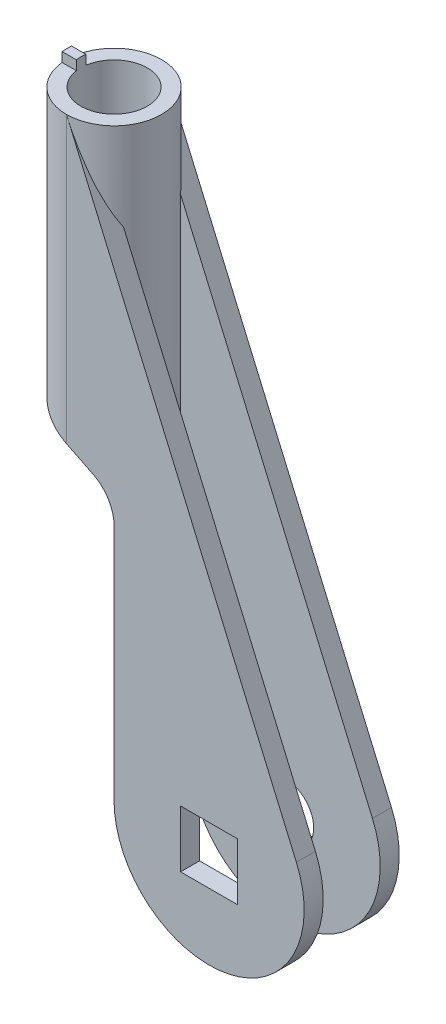
ISO-10303-21;
HEADER;
FILE_DESCRIPTION(('STEP AP214'),'2;1');
FILE_NAME('part.step','',(''),(''),'','','');
FILE_SCHEMA(('AUTOMOTIVE_DESIGN { 1 0 10303 214 1 1 1 1 }'));
ENDSEC;
DATA;
#1=APPLICATION_CONTEXT('core data for automotive mechanical design processes');
#2=APPLICATION_PROTOCOL_DEFINITION('international standard','automotive_design',2000,#1);
#3=PRODUCT_CONTEXT('',#1,'mechanical');
#4=PRODUCT('Part','Part','',(#3));
#5=PRODUCT_RELATED_PRODUCT_CATEGORY('part','',(#4));
#6=PRODUCT_DEFINITION_FORMATION('','',#4);
#7=PRODUCT_DEFINITION_CONTEXT('part definition',#1,'design');
#8=PRODUCT_DEFINITION('design','',#6,#7);
#9=PRODUCT_DEFINITION_SHAPE('','',#8);
#10=(LENGTH_UNIT() NAMED_UNIT(*) SI_UNIT(.MILLI.,.METRE.));
#11=(NAMED_UNIT(*) PLANE_ANGLE_UNIT() SI_UNIT($,.RADIAN.));
#12=(NAMED_UNIT(*) SI_UNIT($,.STERADIAN.) SOLID_ANGLE_UNIT());
#13=UNCERTAINTY_MEASURE_WITH_UNIT(LENGTH_MEASURE(1.E-05),#10,'distance_accuracy_value','');
#14=(GEOMETRIC_REPRESENTATION_CONTEXT(3) GLOBAL_UNCERTAINTY_ASSIGNED_CONTEXT((#13)) GLOBAL_UNIT_ASSIGNED_CONTEXT((#10,
#11,#12)) REPRESENTATION_CONTEXT('',''));
#15=CARTESIAN_POINT('',(0.,0.,0.));
#16=DIRECTION('',(0.,0.,1.));
#17=DIRECTION('',(1.,0.,0.));
#18=AXIS2_PLACEMENT_3D('',#15,#16,#17);
#19=CARTESIAN_POINT('',(9.57106781187315,60.,11.0355339059263));
#20=DIRECTION('',(0.,1.,0.));
#21=DIRECTION('',(-1.6688267556369E-12,0.,-1.));
#22=AXIS2_PLACEMENT_3D('',#19,#20,#21);
#23=PLANE('',#22);
#24=CARTESIAN_POINT('',(-5.42893218813521,60.,6.0355339059513));
#25=DIRECTION('',(0.,1.,0.));
#26=DIRECTION('',(-1.6688267556369E-12,0.,-1.));
#27=AXIS2_PLACEMENT_3D('',#24,#25,#26);
#28=CIRCLE('',#27,5.);
#29=CARTESIAN_POINT('',(-5.42893218814353,60.0000000000001,1.03553390595129));
#30=VERTEX_POINT('',#29);
#31=CARTESIAN_POINT('',(-10.4038693736683,60.0000000000001,5.53553390595127));
#32=VERTEX_POINT('',#31);
#33=EDGE_CURVE('E365',#30,#32,#28,.T.);
#34=ORIENTED_EDGE('',*,*,#33,.T.);
#35=DIRECTION('',(1.,0.,0.));
#36=VECTOR('',#35,1.);
#37=CARTESIAN_POINT('',(0.,60.,5.5355339059513));
#38=LINE('',#37,#36);
#39=CARTESIAN_POINT('',(-8.89303380327294,60.0000000000001,5.53553390595129));
#40=VERTEX_POINT('',#39);
#41=EDGE_CURVE('E59',#32,#40,#38,.T.);
#42=ORIENTED_EDGE('',*,*,#41,.T.);
#43=CARTESIAN_POINT('',(-5.42893218813521,60.,6.0355339059513));
#44=DIRECTION('',(0.,1.,0.));
#45=DIRECTION('',(-1.6688267556369E-12,0.,-1.));
#46=AXIS2_PLACEMENT_3D('',#43,#44,#45);
#47=CIRCLE('',#46,3.5);
#48=CARTESIAN_POINT('',(-8.89303380327297,60.,6.5355339059513));
#49=VERTEX_POINT('',#48);
#50=EDGE_CURVE('E273',#49,#40,#47,.T.);
#51=ORIENTED_EDGE('',*,*,#50,.F.);
#52=DIRECTION('',(1.,0.,0.));
#53=VECTOR('',#52,1.);
#54=CARTESIAN_POINT('',(0.,60.,6.5355339059513));
#55=LINE('',#54,#53);
#56=CARTESIAN_POINT('',(-10.4038693736683,59.9999999999999,6.53553390595124));
#57=VERTEX_POINT('',#56);
#58=EDGE_CURVE('E214',#57,#49,#55,.T.);
#59=ORIENTED_EDGE('',*,*,#58,.F.);
#60=CARTESIAN_POINT('',(-5.42893218812687,60.,11.0355339059513));
#61=VERTEX_POINT('',#60);
#62=EDGE_CURVE('E374',#57,#61,#28,.T.);
#63=ORIENTED_EDGE('',*,*,#62,.T.);
#64=EDGE_CURVE('E368',#61,#30,#28,.T.);
#65=ORIENTED_EDGE('',*,*,#64,.T.);
#66=EDGE_LOOP('',(#34,#42,#51,#59,#63,#65));
#67=FACE_BOUND('',#66,.T.);
#68=ADVANCED_FACE('F44',(#67),#23,.T.);
#69=EDGE_CURVE('E371',#32,#57,#28,.T.);
#70=ORIENTED_EDGE('',*,*,#69,.T.);
#71=DIRECTION('',(0.,0.,-0.999999999999999));
#72=VECTOR('',#71,1.);
#73=CARTESIAN_POINT('',(-10.4038693736684,60.,0.));
#74=LINE('',#73,#72);
#75=EDGE_CURVE('E225',#57,#32,#74,.T.);
#76=ORIENTED_EDGE('',*,*,#75,.T.);
#77=EDGE_LOOP('',(#70,#76));
#78=FACE_BOUND('',#77,.T.);
#79=ADVANCED_FACE('F356',(#78),#23,.T.);
#80=CARTESIAN_POINT('',(-4.42893218814358,25.0433612547143,1.03553390594963));
#81=DIRECTION('',(1.6688267556369E-12,0.,1.));
#82=DIRECTION('',(1.,0.,-1.66950285710849E-12));
#83=AXIS2_PLACEMENT_3D('',#80,#81,#82);
#84=CYLINDRICAL_SURFACE('',#83,4.);
#85=CARTESIAN_POINT('',(-2.65608144814369,28.6290271975656,8.17125363796861));
#86=CARTESIAN_POINT('',(-2.59947304160336,28.6010404334438,8.09773247455495));
#87=CARTESIAN_POINT('',(-2.5458343863294,28.5728488683427,8.02206802871244));
#88=CARTESIAN_POINT('',(-2.44461643168852,28.516952419425,7.86651968466592));
#89=CARTESIAN_POINT('',(-2.39704237177961,28.4892479740253,7.78663222117927));
#90=CARTESIAN_POINT('',(-2.26310803119054,28.4079047376702,7.53977461289583));
#91=CARTESIAN_POINT('',(-2.18634107484344,28.3564578399003,7.36665181326748));
#92=CARTESIAN_POINT('',(-2.07061440016777,28.274862328395,7.03440468530713));
#93=CARTESIAN_POINT('',(-2.02767391852254,28.2426620047851,6.87717304754921));
#94=CARTESIAN_POINT('',(-1.96407165187108,28.1939335290622,6.55639744599862));
#95=CARTESIAN_POINT('',(-1.9433194223138,28.1773417862052,6.39288194470546));
#96=CARTESIAN_POINT('',(-1.92512236978287,28.1628327762202,6.06285772337778));
#97=CARTESIAN_POINT('',(-1.92779451929789,28.1650092294836,5.89633812995289));
#98=CARTESIAN_POINT('',(-1.95654968119447,28.1878202798559,5.56643984367559));
#99=CARTESIAN_POINT('',(-1.98267055756278,28.2084847303987,5.40306666751046));
#100=CARTESIAN_POINT('',(-2.05480709207526,28.2628977486258,5.09244071423059));
#101=CARTESIAN_POINT('',(-2.09971857398665,28.295910727965,4.94479139989025));
#102=CARTESIAN_POINT('',(-2.20754311348656,28.3704785789696,4.65856402719408));
#103=CARTESIAN_POINT('',(-2.27045743018141,28.4120340480338,4.51998660415358));
#104=CARTESIAN_POINT('',(-2.38745099135087,28.4835987559347,4.30093380372427));
#105=CARTESIAN_POINT('',(-2.43664463654024,28.5124230676206,4.2174017414817));
#106=CARTESIAN_POINT('',(-2.54153232794323,28.5705859980704,4.05507736432179));
#107=CARTESIAN_POINT('',(-2.59720749077307,28.5999229211695,3.97627224623719));
#108=CARTESIAN_POINT('',(-2.6560814481508,28.6290271975657,3.89981417392474));
#109=B_SPLINE_CURVE_WITH_KNOTS('',3,(#85,#86,#87,#88,#89,#90,#91,#92,#93,#94,#95,#96,#97,#98,
#99,#100,#101,#102,#103,#104,#105,#106,#107,#108),.UNSPECIFIED.,.F.,.F.,(4,2,2,2,2,2,2,2,2,2,2,
4),(0.,0.290583111722299,0.581415593062103,1.1671879678296,1.66361088163463,2.15800245235231,
2.65486422851952,3.15252976156556,3.62433832928742,4.09617990305655,4.39929511572905,
4.70154834256747),.UNSPECIFIED.);
#110=CARTESIAN_POINT('',(-2.65608144814369,28.6290271975656,8.17125363796856));
#111=VERTEX_POINT('',#110);
#112=CARTESIAN_POINT('',(-2.38468650150214,28.4815380350289,7.76254525490521));
#113=VERTEX_POINT('',#112);
#114=EDGE_CURVE('E277',#111,#113,#109,.T.);
#115=ORIENTED_EDGE('',*,*,#114,.T.);
#116=CARTESIAN_POINT('',(-4.42893218812589,25.0433612547143,11.617842823443));
#117=DIRECTION('',(0.,0.746327346242791,0.665579065363533));
#118=DIRECTION('',(2.23603464499337E-12,-0.665579065363533,0.74632734624279));
#119=AXIS2_PLACEMENT_3D('',#116,#117,#118);
#120=ELLIPSE('',#119,6.00980440665639,4.);
#121=CARTESIAN_POINT('',(-1.2889513842407,27.5213686298453,8.83920274220593));
#122=VERTEX_POINT('',#121);
#123=EDGE_CURVE('E239',#113,#122,#120,.F.);
#124=ORIENTED_EDGE('',*,*,#123,.T.);
#125=CARTESIAN_POINT('',(-2.65608144814025,28.6290271975657,10.1962187983349));
#126=CARTESIAN_POINT('',(-2.52347440856721,28.5634294587663,10.1078325729526));
#127=CARTESIAN_POINT('',(-2.3973034191134,28.4919296294869,10.0146065776875));
#128=CARTESIAN_POINT('',(-2.15801586280122,28.3392799317188,9.82034720945337));
#129=CARTESIAN_POINT('',(-2.04486804553051,28.2581541546402,9.71933354037612));
#130=CARTESIAN_POINT('',(-1.83210623381481,28.0888187804616,9.51184426236549));
#131=CARTESIAN_POINT('',(-1.73238126794075,28.0006782728253,9.40542494041571));
#132=CARTESIAN_POINT('',(-1.54485161806082,27.8181077552125,9.1874544467729));
#133=CARTESIAN_POINT('',(-1.45705597895274,27.7236730529025,9.07589946603857));
#134=CARTESIAN_POINT('',(-1.27524266237927,27.5087472187694,8.82407114017819));
#135=CARTESIAN_POINT('',(-1.18400939729774,27.3870488581225,8.68281916086108));
#136=CARTESIAN_POINT('',(-1.01794862274968,27.1380191288297,8.39577150701604));
#137=CARTESIAN_POINT('',(-0.943122404127505,27.0106873179117,8.24997547600923));
#138=CARTESIAN_POINT('',(-0.808986851321167,26.7513915499206,7.95451996042364));
#139=CARTESIAN_POINT('',(-0.749727097751368,26.6194142746281,7.80484976000237));
#140=CARTESIAN_POINT('',(-0.646491829974307,26.3524160668158,7.50307847653511));
#141=CARTESIAN_POINT('',(-0.602512779257779,26.2173958462573,7.35097796448637));
#142=CARTESIAN_POINT('',(-0.520414618088164,25.9118618761323,7.00755502803962));
#143=CARTESIAN_POINT('',(-0.486382116618399,25.7407692124152,6.81576735787453));
#144=CARTESIAN_POINT('',(-0.440873409439674,25.397354012368,6.43131410625835));
#145=CARTESIAN_POINT('',(-0.429349143698314,25.225034886723,6.23865127771172));
#146=CARTESIAN_POINT('',(-0.428935894385796,25.0496466215844,6.0425611598349));
#147=CARTESIAN_POINT('',(-0.428932190854305,25.0465039232627,6.03904751629875));
#148=CARTESIAN_POINT('',(-0.42893218813516,25.0433612547143,6.03553390594305));
#149=B_SPLINE_CURVE_WITH_KNOTS('',3,(#125,#126,#127,#128,#129,#130,#131,#132,#133,#134,#135,
#136,#137,#138,#139,#140,#141,#142,#143,#144,#145,#146,#147,#148),.UNSPECIFIED.,.F.,.F.,(4,2,2,
2,2,2,2,2,2,2,2,4),(0.,0.516397999134937,1.03152980920846,1.54210006168354,2.05305529724287,
2.67489400277838,3.29678161469038,3.9206266153515,4.54432713931521,5.3210862760402,
6.09618504014729,6.11032718013581),.UNSPECIFIED.);
#150=CARTESIAN_POINT('',(-1.42893218813019,27.6891125657789,9.03553390594464));
#151=VERTEX_POINT('',#150);
#152=EDGE_CURVE('E315',#151,#122,#149,.T.);
#153=ORIENTED_EDGE('',*,*,#152,.F.);
#154=CARTESIAN_POINT('',(-4.4289321881302,25.0433612547143,9.03553390594961));
#155=DIRECTION('',(-1.6688267556369E-12,0.,-1.));
#156=DIRECTION('',(-1.,0.,1.66950285710849E-12));
#157=AXIS2_PLACEMENT_3D('',#154,#155,#156);
#158=CIRCLE('',#157,4.);
#159=CARTESIAN_POINT('',(-0.428932188130227,25.0433612547143,9.03553390594305));
#160=VERTEX_POINT('',#159);
#161=EDGE_CURVE('E322',#160,#151,#158,.F.);
#162=ORIENTED_EDGE('',*,*,#161,.F.);
#163=DIRECTION('',(1.6688267556369E-12,0.,1.));
#164=VECTOR('',#163,1.);
#165=CARTESIAN_POINT('',(-0.428932188148573,25.0433612547142,-1.96446609405706));
#166=LINE('',#165,#164);
#167=CARTESIAN_POINT('',(-0.428932188126889,25.0433612547142,11.0355339059429));
#168=VERTEX_POINT('',#167);
#169=EDGE_CURVE('E715',#160,#168,#166,.T.);
#170=ORIENTED_EDGE('',*,*,#169,.T.);
#171=CARTESIAN_POINT('',(-4.42893218812692,25.0433612547143,11.0355339059497));
#172=DIRECTION('',(-1.6688267556369E-12,0.,-1.));
#173=DIRECTION('',(1.,0.,-1.66950285710849E-12));
#174=AXIS2_PLACEMENT_3D('',#171,#172,#173);
#175=CIRCLE('',#174,4.);
#176=CARTESIAN_POINT('',(-2.65608144813889,28.6290271975656,11.0355339059467));
#177=VERTEX_POINT('',#176);
#178=EDGE_CURVE('E714',#177,#168,#175,.T.);
#179=ORIENTED_EDGE('',*,*,#178,.F.);
#180=DIRECTION('',(1.6688267556369E-12,0.,1.));
#181=VECTOR('',#180,1.);
#182=CARTESIAN_POINT('',(-2.65608144815555,28.6290271975656,1.03553390594666));
#183=LINE('',#182,#181);
#184=EDGE_CURVE('E463',#111,#177,#183,.T.);
#185=ORIENTED_EDGE('',*,*,#184,.F.);
#186=EDGE_LOOP('',(#115,#124,#153,#162,#170,#179,#185));
#187=FACE_BOUND('',#186,.T.);
#188=ADVANCED_FACE('F331',(#187),#84,.F.);
#189=CARTESIAN_POINT('',(-5.4289321881352,25.,6.03553390595127));
#190=DIRECTION('',(0.,1.,0.));
#191=DIRECTION('',(-1.6688267556369E-12,0.,-1.));
#192=AXIS2_PLACEMENT_3D('',#189,#190,#191);
#193=CYLINDRICAL_SURFACE('',#192,5.);
#194=DIRECTION('',(0.,1.,0.));
#195=VECTOR('',#194,1.);
#196=CARTESIAN_POINT('',(-5.42893218814358,29.9999999999999,1.03553390595129));
#197=LINE('',#196,#195);
#198=CARTESIAN_POINT('',(-5.42893218814358,29.9999999999999,1.03553390595129));
#199=VERTEX_POINT('',#198);
#200=EDGE_CURVE('E449',#199,#30,#197,.T.);
#201=ORIENTED_EDGE('',*,*,#200,.F.);
#202=CARTESIAN_POINT('',(-5.42893218813523,30.,6.03553390595132));
#203=DIRECTION('',(-0.44321268499701,-0.896416485712832,7.39988962111319E-13));
#204=DIRECTION('',(-0.896416485712833,0.44321268499701,1.49657500419942E-12));
#205=AXIS2_PLACEMENT_3D('',#202,#203,#204);
#206=ELLIPSE('',#205,5.57776444285716,5.);
#207=CARTESIAN_POINT('',(-5.42893218812184,29.9999999999975,11.0355339059514));
#208=VERTEX_POINT('',#207);
#209=EDGE_CURVE('E323',#199,#208,#206,.F.);
#210=ORIENTED_EDGE('',*,*,#209,.T.);
#211=DIRECTION('',(0.,1.,0.));
#212=VECTOR('',#211,1.);
#213=CARTESIAN_POINT('',(-5.42893218812689,30.,11.0355339059513));
#214=LINE('',#213,#212);
#215=EDGE_CURVE('E396',#208,#61,#214,.T.);
#216=ORIENTED_EDGE('',*,*,#215,.T.);
#217=ORIENTED_EDGE('',*,*,#62,.F.);
#218=ORIENTED_EDGE('',*,*,#69,.F.);
#219=ORIENTED_EDGE('',*,*,#33,.F.);
#220=EDGE_LOOP('',(#201,#210,#216,#217,#218,#219));
#221=FACE_BOUND('',#220,.T.);
#222=ADVANCED_FACE('F325',(#221),#193,.T.);
#223=CARTESIAN_POINT('',(-5.42893218813523,30.0216967941788,6.0355339059513));
#224=DIRECTION('',(0.,0.746327346242791,0.665579065363533));
#225=DIRECTION('',(0.,0.665579065363534,-0.74632734624279));
#226=AXIS2_PLACEMENT_3D('',#223,#224,#225);
#227=ELLIPSE('',#226,6.69947312686762,5.);
#228=CARTESIAN_POINT('',(-0.431876780350865,30.1747064816139,5.86396103066786));
#229=VERTEX_POINT('',#228);
#230=EDGE_CURVE('E242',#229,#122,#227,.F.);
#231=ORIENTED_EDGE('',*,*,#230,.F.);
#232=CARTESIAN_POINT('',(-5.42893218813517,30.3462793568973,6.03553390595129));
#233=DIRECTION('',(0.,0.707106781186639,-0.707106781186456));
#234=DIRECTION('',(0.,0.707106781186457,0.707106781186638));
#235=AXIS2_PLACEMENT_3D('',#232,#233,#234);
#236=ELLIPSE('',#235,7.07106781186456,5.);
#237=CARTESIAN_POINT('',(-1.29671717577226,27.5311773886557,3.22043193770891));
#238=VERTEX_POINT('',#237);
#239=EDGE_CURVE('E237',#238,#229,#236,.F.);
#240=ORIENTED_EDGE('',*,*,#239,.F.);
#241=CARTESIAN_POINT('',(-2.65608144815412,28.6290271975656,1.87484901355839));
#242=CARTESIAN_POINT('',(-2.52347440858075,28.5634294587662,1.96323523894033));
#243=CARTESIAN_POINT('',(-2.39730341912661,28.4919296294868,2.056461234205));
#244=CARTESIAN_POINT('',(-2.15801586281377,28.3392799317187,2.25072060243831));
#245=CARTESIAN_POINT('',(-2.04486804554273,28.2581541546402,2.35173427151519));
#246=CARTESIAN_POINT('',(-1.83210623382633,28.0888187804616,2.55922354952512));
#247=CARTESIAN_POINT('',(-1.73238126795192,28.0006782728252,2.66564287147457));
#248=CARTESIAN_POINT('',(-1.54485161807129,27.8181077552124,2.88361336511674));
#249=CARTESIAN_POINT('',(-1.45705597896287,27.7236730529024,2.99516834585076));
#250=CARTESIAN_POINT('',(-1.27524266238858,27.5087472187692,3.24699667171052));
#251=CARTESIAN_POINT('',(-1.18400939730654,27.3870488581224,3.38824865102736));
#252=CARTESIAN_POINT('',(-1.0179486227575,27.1380191288297,3.67529630487187));
#253=CARTESIAN_POINT('',(-0.943122404134855,27.0106873179117,3.82109233587841));
#254=CARTESIAN_POINT('',(-0.808986851327538,26.7513915499205,4.11654785146355));
#255=CARTESIAN_POINT('',(-0.749727097757227,26.619414274628,4.26621805188464));
#256=CARTESIAN_POINT('',(-0.646491829979183,26.3524160668157,4.56798933535157));
#257=CARTESIAN_POINT('',(-0.602512779262182,26.2173958462572,4.72008984740017));
#258=CARTESIAN_POINT('',(-0.520414618091473,25.9118618761324,5.06351278384686));
#259=CARTESIAN_POINT('',(-0.486382116621076,25.7407692124157,5.2553004540121));
#260=CARTESIAN_POINT('',(-0.440873409440901,25.3973540123674,5.63975370562711));
#261=CARTESIAN_POINT('',(-0.429349143698723,25.225034886721,5.83241653417243));
#262=CARTESIAN_POINT('',(-0.42893589438581,25.0496466215844,6.02850665205105));
#263=CARTESIAN_POINT('',(-0.428932190854312,25.0465039232627,6.03202029558728));
#264=CARTESIAN_POINT('',(-0.42893218813516,25.0433612547143,6.03553390594305));
#265=B_SPLINE_CURVE_WITH_KNOTS('',3,(#241,#242,#243,#244,#245,#246,#247,#248,#249,#250,#251,
#252,#253,#254,#255,#256,#257,#258,#259,#260,#261,#262,#263,#264),.UNSPECIFIED.,.F.,.F.,(4,2,2,
2,2,2,2,2,2,2,2,4),(0.,0.516397999134976,1.03152980920852,1.5421000616836,2.05305529724292,
2.67489400277843,3.29678161469041,3.92062661535155,4.5443271393153,5.32108627604024,
6.09618504014724,6.11032718013593),.UNSPECIFIED.);
#266=CARTESIAN_POINT('',(-1.42893218814025,27.6891125657789,3.0355339059446));
#267=VERTEX_POINT('',#266);
#268=EDGE_CURVE('E306',#238,#267,#265,.F.);
#269=ORIENTED_EDGE('',*,*,#268,.T.);
#270=DIRECTION('',(0.,1.,0.));
#271=VECTOR('',#270,1.);
#272=CARTESIAN_POINT('',(-1.42893218814022,21.9999999999998,3.0355339059446));
#273=LINE('',#272,#271);
#274=CARTESIAN_POINT('',(-1.42893218814022,50.7304889851739,3.03553390594455));
#275=VERTEX_POINT('',#274);
#276=EDGE_CURVE('E426',#275,#267,#273,.F.);
#277=ORIENTED_EDGE('',*,*,#276,.F.);
#278=CARTESIAN_POINT('',(-5.42893218813521,60.,6.0355339059513));
#279=DIRECTION('',(-0.918161224763429,-0.396206972857524,1.53292780581282E-12));
#280=DIRECTION('',(-0.396206972857524,0.918161224763428,6.61485820019556E-13));
#281=AXIS2_PLACEMENT_3D('',#278,#279,#280);
#282=ELLIPSE('',#281,12.6196668472011,5.);
#283=EDGE_CURVE('E378',#30,#275,#282,.T.);
#284=ORIENTED_EDGE('',*,*,#283,.F.);
#285=ORIENTED_EDGE('',*,*,#64,.F.);
#286=CARTESIAN_POINT('',(-5.42893218813521,60.,6.0355339059513));
#287=DIRECTION('',(-0.918161224763429,-0.396206972857524,1.53292780581282E-12));
#288=DIRECTION('',(-0.396206972857524,0.918161224763428,6.61485820019556E-13));
#289=AXIS2_PLACEMENT_3D('',#286,#287,#288);
#290=ELLIPSE('',#289,12.6196668472011,5.);
#291=CARTESIAN_POINT('',(-1.4289321881302,50.730488985174,9.03553390594462));
#292=VERTEX_POINT('',#291);
#293=EDGE_CURVE('E405',#292,#61,#290,.T.);
#294=ORIENTED_EDGE('',*,*,#293,.F.);
#295=DIRECTION('',(0.,1.,0.));
#296=VECTOR('',#295,1.);
#297=CARTESIAN_POINT('',(-1.42893218813023,22.,9.03553390594464));
#298=LINE('',#297,#296);
#299=EDGE_CURVE('E373',#292,#151,#298,.F.);
#300=ORIENTED_EDGE('',*,*,#299,.T.);
#301=ORIENTED_EDGE('',*,*,#152,.T.);
#302=EDGE_LOOP('',(#231,#240,#269,#277,#284,#285,#294,#300,#301));
#303=FACE_BOUND('',#302,.T.);
#304=ADVANCED_FACE('F330',(#303),#193,.T.);
#305=CARTESIAN_POINT('',(9.57106781186982,0.,9.03553390592623));
#306=DIRECTION('',(-1.6688267556369E-12,0.,-1.));
#307=DIRECTION('',(-1.,0.,1.66950285710849E-12));
#308=AXIS2_PLACEMENT_3D('',#305,#306,#307);
#309=PLANE('',#308);
#310=DIRECTION('',(0.,-1.,0.));
#311=VECTOR('',#310,1.);
#312=CARTESIAN_POINT('',(12.5710678118698,0.,9.03553390592127));
#313=LINE('',#312,#311);
#314=CARTESIAN_POINT('',(12.5710678118698,3.,9.03553390592136));
#315=VERTEX_POINT('',#314);
#316=CARTESIAN_POINT('',(12.5710678118698,-2.99999999999998,9.03553390592116));
#317=VERTEX_POINT('',#316);
#318=EDGE_CURVE('E271',#315,#317,#313,.T.);
#319=ORIENTED_EDGE('',*,*,#318,.F.);
#320=DIRECTION('',(1.,0.,-1.66950285710849E-12));
#321=VECTOR('',#320,1.);
#322=CARTESIAN_POINT('',(9.57106781186982,2.99999999999994,9.03553390592627));
#323=LINE('',#322,#321);
#324=CARTESIAN_POINT('',(6.57106781186973,2.99999999999995,9.03553390593126));
#325=VERTEX_POINT('',#324);
#326=EDGE_CURVE('E257',#325,#315,#323,.T.);
#327=ORIENTED_EDGE('',*,*,#326,.F.);
#328=DIRECTION('',(0.,1.,0.));
#329=VECTOR('',#328,1.);
#330=CARTESIAN_POINT('',(6.57106781186979,0.,9.03553390593126));
#331=LINE('',#330,#329);
#332=CARTESIAN_POINT('',(6.57106781186973,-3.00000000000004,9.03553390593126));
#333=VERTEX_POINT('',#332);
#334=EDGE_CURVE('E267',#333,#325,#331,.T.);
#335=ORIENTED_EDGE('',*,*,#334,.F.);
#336=DIRECTION('',(-1.,0.,1.66950285710849E-12));
#337=VECTOR('',#336,1.);
#338=CARTESIAN_POINT('',(9.57106781186979,-3.00000000000007,9.03553390592626));
#339=LINE('',#338,#337);
#340=EDGE_CURVE('E269',#317,#333,#339,.T.);
#341=ORIENTED_EDGE('',*,*,#340,.F.);
#342=EDGE_LOOP('',(#319,#327,#335,#341));
#343=FACE_BOUND('',#342,.T.);
#344=DIRECTION('',(0.,1.,0.));
#345=VECTOR('',#344,1.);
#346=CARTESIAN_POINT('',(-0.428932188130227,0.,9.03553390594294));
#347=LINE('',#346,#345);
#348=CARTESIAN_POINT('',(-0.428932188130227,0.,9.03553390594294));
#349=VERTEX_POINT('',#348);
#350=EDGE_CURVE('E386',#349,#160,#347,.T.);
#351=ORIENTED_EDGE('',*,*,#350,.T.);
#352=ORIENTED_EDGE('',*,*,#161,.T.);
#353=ORIENTED_EDGE('',*,*,#299,.F.);
#354=DIRECTION('',(0.396206972857524,-0.918161224763428,-6.61485820019556E-13));
#355=VECTOR('',#354,1.);
#356=CARTESIAN_POINT('',(18.7526800595041,3.96206972857523,9.03553390591092));
#357=LINE('',#356,#355);
#358=CARTESIAN_POINT('',(18.7526800595041,3.96206972857523,9.03553390591092));
#359=VERTEX_POINT('',#358);
#360=EDGE_CURVE('E389',#292,#359,#357,.T.);
#361=ORIENTED_EDGE('',*,*,#360,.T.);
#362=CARTESIAN_POINT('',(9.57106781186982,0.,9.03553390592623));
#363=DIRECTION('',(-1.6688267556369E-12,0.,-1.));
#364=DIRECTION('',(-1.,0.,1.66950285710849E-12));
#365=AXIS2_PLACEMENT_3D('',#362,#363,#364);
#366=CIRCLE('',#365,10.);
#367=EDGE_CURVE('E383',#359,#349,#366,.T.);
#368=ORIENTED_EDGE('',*,*,#367,.T.);
#369=EDGE_LOOP('',(#351,#352,#353,#361,#368));
#370=FACE_BOUND('',#369,.T.);
#371=ADVANCED_FACE('F334',(#343,#370),#309,.T.);
#372=CARTESIAN_POINT('',(9.57106781187312,0.,11.0355339059263));
#373=DIRECTION('',(-1.6688267556369E-12,0.,-1.));
#374=DIRECTION('',(-1.,0.,1.66950285710849E-12));
#375=AXIS2_PLACEMENT_3D('',#372,#373,#374);
#376=PLANE('',#375);
#377=DIRECTION('',(-1.,0.,1.66950285710849E-12));
#378=VECTOR('',#377,1.);
#379=CARTESIAN_POINT('',(6.57106781187307,2.99999999999992,11.0355339059313));
#380=LINE('',#379,#378);
#381=CARTESIAN_POINT('',(12.5710678118731,3.00000000000003,11.0355339059213));
#382=VERTEX_POINT('',#381);
#383=CARTESIAN_POINT('',(6.57106781187307,2.99999999999992,11.0355339059313));
#384=VERTEX_POINT('',#383);
#385=EDGE_CURVE('E246',#382,#384,#380,.T.);
#386=ORIENTED_EDGE('',*,*,#385,.F.);
#387=DIRECTION('',(0.,1.,0.));
#388=VECTOR('',#387,1.);
#389=CARTESIAN_POINT('',(12.5710678118731,3.00000000000003,11.0355339059213));
#390=LINE('',#389,#388);
#391=CARTESIAN_POINT('',(12.5710678118732,-3.00000000000003,11.0355339059214));
#392=VERTEX_POINT('',#391);
#393=EDGE_CURVE('E244',#392,#382,#390,.T.);
#394=ORIENTED_EDGE('',*,*,#393,.F.);
#395=DIRECTION('',(1.,0.,-1.66950285710849E-12));
#396=VECTOR('',#395,1.);
#397=CARTESIAN_POINT('',(6.57106781187309,-3.00000000000004,11.0355339059313));
#398=LINE('',#397,#396);
#399=CARTESIAN_POINT('',(6.57106781187309,-3.00000000000004,11.0355339059313));
#400=VERTEX_POINT('',#399);
#401=EDGE_CURVE('E250',#400,#392,#398,.T.);
#402=ORIENTED_EDGE('',*,*,#401,.F.);
#403=DIRECTION('',(0.,-1.,0.));
#404=VECTOR('',#403,1.);
#405=CARTESIAN_POINT('',(6.57106781187307,2.99999999999992,11.0355339059313));
#406=LINE('',#405,#404);
#407=EDGE_CURVE('E248',#384,#400,#406,.T.);
#408=ORIENTED_EDGE('',*,*,#407,.F.);
#409=EDGE_LOOP('',(#386,#394,#402,#408));
#410=FACE_BOUND('',#409,.T.);
#411=DIRECTION('',(0.896416485712833,-0.44321268499701,-1.49657500419942E-12));
#412=VECTOR('',#411,1.);
#413=CARTESIAN_POINT('',(-2.65608144813889,28.6290271975656,11.0355339059467));
#414=LINE('',#413,#412);
#415=EDGE_CURVE('E286',#208,#177,#414,.T.);
#416=ORIENTED_EDGE('',*,*,#415,.T.);
#417=ORIENTED_EDGE('',*,*,#178,.T.);
#418=DIRECTION('',(0.,1.,0.));
#419=VECTOR('',#418,1.);
#420=CARTESIAN_POINT('',(-0.428932188126917,24.9999999999999,11.035533905943));
#421=LINE('',#420,#419);
#422=CARTESIAN_POINT('',(-0.428932188126917,0.,11.035533905943));
#423=VERTEX_POINT('',#422);
#424=EDGE_CURVE('E394',#423,#168,#421,.T.);
#425=ORIENTED_EDGE('',*,*,#424,.F.);
#426=CARTESIAN_POINT('',(9.57106781187312,0.,11.0355339059263));
#427=DIRECTION('',(-1.6688267556369E-12,0.,-1.));
#428=DIRECTION('',(-1.,0.,1.66950285710849E-12));
#429=AXIS2_PLACEMENT_3D('',#426,#427,#428);
#430=CIRCLE('',#429,10.);
#431=CARTESIAN_POINT('',(18.7526800595074,3.96206972857529,11.0355339059108));
#432=VERTEX_POINT('',#431);
#433=EDGE_CURVE('E382',#432,#423,#430,.T.);
#434=ORIENTED_EDGE('',*,*,#433,.F.);
#435=DIRECTION('',(0.396206972857524,-0.918161224763428,-6.61485820019556E-13));
#436=VECTOR('',#435,1.);
#437=CARTESIAN_POINT('',(18.7526800595074,3.96206972857529,11.0355339059108));
#438=LINE('',#437,#436);
#439=EDGE_CURVE('E387',#61,#432,#438,.T.);
#440=ORIENTED_EDGE('',*,*,#439,.F.);
#441=ORIENTED_EDGE('',*,*,#215,.F.);
#442=EDGE_LOOP('',(#416,#417,#425,#434,#440,#441));
#443=FACE_BOUND('',#442,.T.);
#444=ADVANCED_FACE('F338',(#410,#443),#376,.F.);
#445=CARTESIAN_POINT('',(9.57106781186982,0.,9.03553390592623));
#446=DIRECTION('',(1.6688267556369E-12,0.,1.));
#447=DIRECTION('',(1.,0.,-1.66950285710849E-12));
#448=AXIS2_PLACEMENT_3D('',#445,#446,#447);
#449=CYLINDRICAL_SURFACE('',#448,10.);
#450=ORIENTED_EDGE('',*,*,#433,.T.);
#451=DIRECTION('',(1.6688267556369E-12,0.,1.));
#452=VECTOR('',#451,1.);
#453=CARTESIAN_POINT('',(-0.428932188130227,0.,9.03553390594294));
#454=LINE('',#453,#452);
#455=EDGE_CURVE('E402',#349,#423,#454,.T.);
#456=ORIENTED_EDGE('',*,*,#455,.F.);
#457=ORIENTED_EDGE('',*,*,#367,.F.);
#458=DIRECTION('',(1.6688267556369E-12,0.,1.));
#459=VECTOR('',#458,1.);
#460=CARTESIAN_POINT('',(18.7526800595041,3.96206972857523,9.03553390591092));
#461=LINE('',#460,#459);
#462=EDGE_CURVE('E391',#359,#432,#461,.T.);
#463=ORIENTED_EDGE('',*,*,#462,.T.);
#464=EDGE_LOOP('',(#450,#456,#457,#463));
#465=FACE_BOUND('',#464,.T.);
#466=ADVANCED_FACE('F46',(#465),#449,.T.);
#467=CARTESIAN_POINT('',(-0.428932188130199,25.,9.03553390594306));
#468=DIRECTION('',(1.,0.,-1.66950285710849E-12));
#469=DIRECTION('',(-1.6688267556369E-12,0.,-1.));
#470=AXIS2_PLACEMENT_3D('',#467,#468,#469);
#471=PLANE('',#470);
#472=ORIENTED_EDGE('',*,*,#169,.F.);
#473=ORIENTED_EDGE('',*,*,#350,.F.);
#474=ORIENTED_EDGE('',*,*,#455,.T.);
#475=ORIENTED_EDGE('',*,*,#424,.T.);
#476=EDGE_LOOP('',(#472,#473,#474,#475));
#477=FACE_BOUND('',#476,.T.);
#478=ADVANCED_FACE('F346',(#477),#471,.F.);
#479=CARTESIAN_POINT('',(18.7526800595041,3.96206972857523,9.03553390591092));
#480=DIRECTION('',(-0.918161224763429,-0.396206972857524,1.53292780581282E-12));
#481=DIRECTION('',(-0.396206972857524,0.918161224763428,6.61485820019556E-13));
#482=AXIS2_PLACEMENT_3D('',#479,#480,#481);
#483=PLANE('',#482);
#484=ORIENTED_EDGE('',*,*,#360,.F.);
#485=ORIENTED_EDGE('',*,*,#293,.T.);
#486=ORIENTED_EDGE('',*,*,#439,.T.);
#487=ORIENTED_EDGE('',*,*,#462,.F.);
#488=EDGE_LOOP('',(#484,#485,#486,#487));
#489=FACE_BOUND('',#488,.T.);
#490=ADVANCED_FACE('F343',(#489),#483,.F.);
#491=CARTESIAN_POINT('',(9.57106781185647,0.,1.03553390592626));
#492=DIRECTION('',(-1.6688267556369E-12,0.,-1.));
#493=DIRECTION('',(-1.,0.,1.66950285710849E-12));
#494=AXIS2_PLACEMENT_3D('',#491,#492,#493);
#495=PLANE('',#494);
#496=CARTESIAN_POINT('',(9.57106781185647,0.,1.03553390592626));
#497=DIRECTION('',(-1.6688267556369E-12,0.,-1.));
#498=DIRECTION('',(-1.,0.,1.66950285710849E-12));
#499=AXIS2_PLACEMENT_3D('',#496,#497,#498);
#500=CIRCLE('',#499,10.);
#501=CARTESIAN_POINT('',(18.7526800594908,3.96206972857523,1.03553390591094));
#502=VERTEX_POINT('',#501);
#503=CARTESIAN_POINT('',(-0.428932188143577,0.,1.03553390594296));
#504=VERTEX_POINT('',#503);
#505=EDGE_CURVE('E438',#502,#504,#500,.T.);
#506=ORIENTED_EDGE('',*,*,#505,.T.);
#507=DIRECTION('',(0.,1.,0.));
#508=VECTOR('',#507,1.);
#509=CARTESIAN_POINT('',(-0.428932188143577,0.,1.03553390594296));
#510=LINE('',#509,#508);
#511=CARTESIAN_POINT('',(-0.428932188143577,25.0433612547144,1.03553390594297));
#512=VERTEX_POINT('',#511);
#513=EDGE_CURVE('E441',#504,#512,#510,.T.);
#514=ORIENTED_EDGE('',*,*,#513,.T.);
#515=CARTESIAN_POINT('',(-4.42893218814358,25.0433612547143,1.03553390594963));
#516=DIRECTION('',(1.6688267556369E-12,0.,1.));
#517=DIRECTION('',(1.,0.,-1.66950285710849E-12));
#518=AXIS2_PLACEMENT_3D('',#515,#516,#517);
#519=CIRCLE('',#518,4.);
#520=CARTESIAN_POINT('',(-2.65608144815555,28.6290271975656,1.03553390594666));
#521=VERTEX_POINT('',#520);
#522=EDGE_CURVE('E444',#512,#521,#519,.T.);
#523=ORIENTED_EDGE('',*,*,#522,.T.);
#524=DIRECTION('',(-0.896416485712831,0.443212684997013,1.49668602650188E-12));
#525=VECTOR('',#524,1.);
#526=CARTESIAN_POINT('',(-2.65608144815555,28.6290271975656,1.03553390594666));
#527=LINE('',#526,#525);
#528=EDGE_CURVE('E446',#521,#199,#527,.T.);
#529=ORIENTED_EDGE('',*,*,#528,.T.);
#530=ORIENTED_EDGE('',*,*,#200,.T.);
#531=DIRECTION('',(0.396206972857524,-0.918161224763428,-6.61485820019556E-13));
#532=VECTOR('',#531,1.);
#533=CARTESIAN_POINT('',(-5.42893218814353,60.0000000000001,1.03553390595129));
#534=LINE('',#533,#532);
#535=EDGE_CURVE('E452',#30,#502,#534,.T.);
#536=ORIENTED_EDGE('',*,*,#535,.T.);
#537=EDGE_LOOP('',(#506,#514,#523,#529,#530,#536));
#538=FACE_BOUND('',#537,.T.);
#539=CARTESIAN_POINT('',(9.57106781185647,0.,1.03553390592626));
#540=DIRECTION('',(-1.6688267556369E-12,0.,-1.));
#541=DIRECTION('',(-1.,0.,1.66950285710849E-12));
#542=AXIS2_PLACEMENT_3D('',#539,#540,#541);
#543=CIRCLE('',#542,3.);
#544=CARTESIAN_POINT('',(12.5710678118565,0.,1.03553390592125));
#545=VERTEX_POINT('',#544);
#546=EDGE_CURVE('E432',#545,#545,#543,.T.);
#547=ORIENTED_EDGE('',*,*,#546,.F.);
#548=EDGE_LOOP('',(#547));
#549=FACE_BOUND('',#548,.T.);
#550=ADVANCED_FACE('F345',(#538,#549),#495,.T.);
#551=CARTESIAN_POINT('',(9.57106781185977,0.,3.03553390592626));
#552=DIRECTION('',(-1.6688267556369E-12,0.,-1.));
#553=DIRECTION('',(-1.,0.,1.66950285710849E-12));
#554=AXIS2_PLACEMENT_3D('',#551,#552,#553);
#555=PLANE('',#554);
#556=ORIENTED_EDGE('',*,*,#276,.T.);
#557=CARTESIAN_POINT('',(-4.42893218814022,25.0433612547143,3.03553390594963));
#558=DIRECTION('',(1.6688267556369E-12,0.,1.));
#559=DIRECTION('',(1.,0.,-1.66950285710849E-12));
#560=AXIS2_PLACEMENT_3D('',#557,#558,#559);
#561=CIRCLE('',#560,4.);
#562=CARTESIAN_POINT('',(-0.428932188140191,25.0433612547143,3.03553390594294));
#563=VERTEX_POINT('',#562);
#564=EDGE_CURVE('E422',#563,#267,#561,.T.);
#565=ORIENTED_EDGE('',*,*,#564,.F.);
#566=DIRECTION('',(0.,1.,0.));
#567=VECTOR('',#566,1.);
#568=CARTESIAN_POINT('',(-0.428932188140246,25.0278640450005,3.03553390594294));
#569=LINE('',#568,#567);
#570=CARTESIAN_POINT('',(-0.428932188140246,0.,3.03553390594296));
#571=VERTEX_POINT('',#570);
#572=EDGE_CURVE('E457',#571,#563,#569,.T.);
#573=ORIENTED_EDGE('',*,*,#572,.F.);
#574=CARTESIAN_POINT('',(9.57106781185977,0.,3.03553390592626));
#575=DIRECTION('',(-1.6688267556369E-12,0.,-1.));
#576=DIRECTION('',(-1.,0.,1.66950285710849E-12));
#577=AXIS2_PLACEMENT_3D('',#574,#575,#576);
#578=CIRCLE('',#577,10.);
#579=CARTESIAN_POINT('',(18.7526800594941,3.96206972857527,3.03553390591091));
#580=VERTEX_POINT('',#579);
#581=EDGE_CURVE('E436',#580,#571,#578,.T.);
#582=ORIENTED_EDGE('',*,*,#581,.F.);
#583=DIRECTION('',(0.396206972857524,-0.918161224763428,-6.61485820019556E-13));
#584=VECTOR('',#583,1.);
#585=CARTESIAN_POINT('',(-5.42893218814029,60.0000000000001,3.03553390595129));
#586=LINE('',#585,#584);
#587=EDGE_CURVE('E442',#275,#580,#586,.T.);
#588=ORIENTED_EDGE('',*,*,#587,.F.);
#589=EDGE_LOOP('',(#556,#565,#573,#582,#588));
#590=FACE_BOUND('',#589,.T.);
#591=CARTESIAN_POINT('',(9.57106781185977,0.,3.03553390592626));
#592=DIRECTION('',(-1.6688267556369E-12,0.,-1.));
#593=DIRECTION('',(-1.,0.,1.66950285710849E-12));
#594=AXIS2_PLACEMENT_3D('',#591,#592,#593);
#595=CIRCLE('',#594,3.);
#596=CARTESIAN_POINT('',(12.5710678118598,0.,3.03553390592125));
#597=VERTEX_POINT('',#596);
#598=EDGE_CURVE('E428',#597,#597,#595,.T.);
#599=ORIENTED_EDGE('',*,*,#598,.T.);
#600=EDGE_LOOP('',(#599));
#601=FACE_BOUND('',#600,.T.);
#602=ADVANCED_FACE('F682',(#590,#601),#555,.F.);
#603=CARTESIAN_POINT('',(9.57106781185647,0.,1.03553390592626));
#604=DIRECTION('',(1.6688267556369E-12,0.,1.));
#605=DIRECTION('',(1.,0.,-1.66950285710849E-12));
#606=AXIS2_PLACEMENT_3D('',#603,#604,#605);
#607=CYLINDRICAL_SURFACE('',#606,10.);
#608=ORIENTED_EDGE('',*,*,#581,.T.);
#609=DIRECTION('',(1.6688267556369E-12,0.,1.));
#610=VECTOR('',#609,1.);
#611=CARTESIAN_POINT('',(-0.428932188143577,0.,1.03553390594296));
#612=LINE('',#611,#610);
#613=EDGE_CURVE('E468',#504,#571,#612,.T.);
#614=ORIENTED_EDGE('',*,*,#613,.F.);
#615=ORIENTED_EDGE('',*,*,#505,.F.);
#616=DIRECTION('',(1.6688267556369E-12,0.,1.));
#617=VECTOR('',#616,1.);
#618=CARTESIAN_POINT('',(18.7526800594908,3.96206972857523,1.03553390591094));
#619=LINE('',#618,#617);
#620=EDGE_CURVE('E454',#502,#580,#619,.T.);
#621=ORIENTED_EDGE('',*,*,#620,.T.);
#622=EDGE_LOOP('',(#608,#614,#615,#621));
#623=FACE_BOUND('',#622,.T.);
#624=ADVANCED_FACE('F673',(#623),#607,.T.);
#625=CARTESIAN_POINT('',(-0.428932188143577,25.0278640450004,1.03553390594297));
#626=DIRECTION('',(1.,0.,-1.66950285710849E-12));
#627=DIRECTION('',(-1.6688267556369E-12,0.,-1.));
#628=AXIS2_PLACEMENT_3D('',#625,#626,#627);
#629=PLANE('',#628);
#630=DIRECTION('',(1.6688267556369E-12,0.,1.));
#631=VECTOR('',#630,1.);
#632=CARTESIAN_POINT('',(-0.428932188143577,25.0433612547144,1.03553390594297));
#633=LINE('',#632,#631);
#634=EDGE_CURVE('E467',#512,#563,#633,.T.);
#635=ORIENTED_EDGE('',*,*,#634,.F.);
#636=ORIENTED_EDGE('',*,*,#513,.F.);
#637=ORIENTED_EDGE('',*,*,#613,.T.);
#638=ORIENTED_EDGE('',*,*,#572,.T.);
#639=EDGE_LOOP('',(#635,#636,#637,#638));
#640=FACE_BOUND('',#639,.T.);
#641=ADVANCED_FACE('F650',(#640),#629,.F.);
#642=ORIENTED_EDGE('',*,*,#268,.F.);
#643=CARTESIAN_POINT('',(-4.42893218814407,25.0433612547142,0.732615803766934));
#644=DIRECTION('',(0.,0.707106781186639,-0.707106781186456));
#645=DIRECTION('',(2.3605261158139E-12,0.707106781186457,0.707106781186638));
#646=AXIS2_PLACEMENT_3D('',#643,#644,#645);
#647=ELLIPSE('',#646,5.65685424949311,4.);
#648=CARTESIAN_POINT('',(-2.44515491571953,28.516778553778,4.20603310283155));
#649=VERTEX_POINT('',#648);
#650=EDGE_CURVE('E234',#238,#649,#647,.F.);
#651=ORIENTED_EDGE('',*,*,#650,.T.);
#652=CARTESIAN_POINT('',(-2.65608144815083,28.6290271975657,3.89981417392474));
#653=VERTEX_POINT('',#652);
#654=EDGE_CURVE('E276',#649,#653,#109,.T.);
#655=ORIENTED_EDGE('',*,*,#654,.T.);
#656=EDGE_CURVE('E464',#521,#653,#183,.T.);
#657=ORIENTED_EDGE('',*,*,#656,.F.);
#658=ORIENTED_EDGE('',*,*,#522,.F.);
#659=ORIENTED_EDGE('',*,*,#634,.T.);
#660=ORIENTED_EDGE('',*,*,#564,.T.);
#661=EDGE_LOOP('',(#642,#651,#655,#657,#658,#659,#660));
#662=FACE_BOUND('',#661,.T.);
#663=ADVANCED_FACE('F288',(#662),#84,.F.);
#664=CARTESIAN_POINT('',(-2.65608144815555,28.6290271975656,1.03553390594666));
#665=DIRECTION('',(0.443212684997014,0.89641648571283,-7.40002839899127E-13));
#666=DIRECTION('',(0.896416485712831,-0.443212684997013,-1.49668602650188E-12));
#667=AXIS2_PLACEMENT_3D('',#664,#665,#666);
#668=PLANE('',#667);
#669=ORIENTED_EDGE('',*,*,#656,.T.);
#670=CARTESIAN_POINT('',(-5.42893218813523,30.,6.0355339059513));
#671=DIRECTION('',(0.443212684997014,0.89641648571283,-7.40002839899127E-13));
#672=DIRECTION('',(-0.896416485712831,0.443212684997013,1.49668602650188E-12));
#673=AXIS2_PLACEMENT_3D('',#670,#671,#672);
#674=ELLIPSE('',#673,3.90443511000002,3.5);
#675=EDGE_CURVE('E408',#653,#111,#674,.T.);
#676=ORIENTED_EDGE('',*,*,#675,.T.);
#677=ORIENTED_EDGE('',*,*,#184,.T.);
#678=ORIENTED_EDGE('',*,*,#415,.F.);
#679=ORIENTED_EDGE('',*,*,#209,.F.);
#680=ORIENTED_EDGE('',*,*,#528,.F.);
#681=EDGE_LOOP('',(#669,#676,#677,#678,#679,#680));
#682=FACE_BOUND('',#681,.T.);
#683=ADVANCED_FACE('F649',(#682),#668,.F.);
#684=CARTESIAN_POINT('',(-5.42893218814353,60.0000000000001,1.03553390595129));
#685=DIRECTION('',(-0.918161224763429,-0.396206972857524,1.53292780581282E-12));
#686=DIRECTION('',(-0.396206972857524,0.918161224763428,6.61485820019556E-13));
#687=AXIS2_PLACEMENT_3D('',#684,#685,#686);
#688=PLANE('',#687);
#689=ORIENTED_EDGE('',*,*,#535,.F.);
#690=ORIENTED_EDGE('',*,*,#283,.T.);
#691=ORIENTED_EDGE('',*,*,#587,.T.);
#692=ORIENTED_EDGE('',*,*,#620,.F.);
#693=EDGE_LOOP('',(#689,#690,#691,#692));
#694=FACE_BOUND('',#693,.T.);
#695=ADVANCED_FACE('F660',(#694),#688,.F.);
#696=CARTESIAN_POINT('',(9.57106781185647,0.,1.03553390592626));
#697=DIRECTION('',(1.6688267556369E-12,0.,1.));
#698=DIRECTION('',(1.,0.,-1.66950285710849E-12));
#699=AXIS2_PLACEMENT_3D('',#696,#697,#698);
#700=CYLINDRICAL_SURFACE('',#699,3.);
#701=CARTESIAN_POINT('',(12.5710678118565,0.,1.03553390592125));
#702=CARTESIAN_POINT('',(12.5710678118565,0.,1.05636723925459));
#703=CARTESIAN_POINT('',(12.5710678118565,0.,1.07720057258792));
#704=CARTESIAN_POINT('',(12.5710678118566,0.,1.11886723925459));
#705=CARTESIAN_POINT('',(12.5710678118567,0.,1.13970057258792));
#706=CARTESIAN_POINT('',(12.5710678118567,0.,1.18136723925459));
#707=CARTESIAN_POINT('',(12.5710678118568,0.,1.20220057258792));
#708=CARTESIAN_POINT('',(12.5710678118568,0.,1.24386723925459));
#709=CARTESIAN_POINT('',(12.5710678118569,0.,1.26470057258792));
#710=CARTESIAN_POINT('',(12.5710678118569,0.,1.30636723925459));
#711=CARTESIAN_POINT('',(12.571067811857,0.,1.32720057258792));
#712=CARTESIAN_POINT('',(12.571067811857,0.,1.36886723925459));
#713=CARTESIAN_POINT('',(12.5710678118571,0.,1.38970057258792));
#714=CARTESIAN_POINT('',(12.5710678118571,0.,1.43136723925459));
#715=CARTESIAN_POINT('',(12.5710678118572,0.,1.45220057258792));
#716=CARTESIAN_POINT('',(12.5710678118572,0.,1.49386723925459));
#717=CARTESIAN_POINT('',(12.5710678118573,0.,1.51470057258792));
#718=CARTESIAN_POINT('',(12.5710678118573,0.,1.55636723925459));
#719=CARTESIAN_POINT('',(12.5710678118574,0.,1.57720057258792));
#720=CARTESIAN_POINT('',(12.5710678118575,0.,1.61886723925459));
#721=CARTESIAN_POINT('',(12.5710678118575,0.,1.63970057258792));
#722=CARTESIAN_POINT('',(12.5710678118576,0.,1.68136723925459));
#723=CARTESIAN_POINT('',(12.5710678118576,0.,1.70220057258792));
#724=CARTESIAN_POINT('',(12.5710678118577,0.,1.74386723925459));
#725=CARTESIAN_POINT('',(12.5710678118577,0.,1.76470057258792));
#726=CARTESIAN_POINT('',(12.5710678118578,0.,1.80636723925459));
#727=CARTESIAN_POINT('',(12.5710678118578,0.,1.82720057258792));
#728=CARTESIAN_POINT('',(12.5710678118579,0.,1.86886723925459));
#729=CARTESIAN_POINT('',(12.5710678118579,0.,1.88970057258792));
#730=CARTESIAN_POINT('',(12.571067811858,0.,1.93136723925459));
#731=CARTESIAN_POINT('',(12.571067811858,0.,1.95220057258792));
#732=CARTESIAN_POINT('',(12.5710678118581,0.,1.99386723925459));
#733=CARTESIAN_POINT('',(12.5710678118581,0.,2.01470057258792));
#734=CARTESIAN_POINT('',(12.5710678118582,0.,2.05636723925459));
#735=CARTESIAN_POINT('',(12.5710678118582,0.,2.07720057258792));
#736=CARTESIAN_POINT('',(12.5710678118583,0.,2.11886723925459));
#737=CARTESIAN_POINT('',(12.5710678118583,0.,2.13970057258792));
#738=CARTESIAN_POINT('',(12.5710678118584,0.,2.18136723925459));
#739=CARTESIAN_POINT('',(12.5710678118584,0.,2.20220057258792));
#740=CARTESIAN_POINT('',(12.5710678118585,0.,2.24386723925459));
#741=CARTESIAN_POINT('',(12.5710678118585,0.,2.26470057258792));
#742=CARTESIAN_POINT('',(12.5710678118586,0.,2.30636723925459));
#743=CARTESIAN_POINT('',(12.5710678118586,0.,2.32720057258792));
#744=CARTESIAN_POINT('',(12.5710678118587,0.,2.36886723925458));
#745=CARTESIAN_POINT('',(12.5710678118587,0.,2.38970057258792));
#746=CARTESIAN_POINT('',(12.5710678118588,0.,2.43136723925459));
#747=CARTESIAN_POINT('',(12.5710678118588,0.,2.45220057258792));
#748=CARTESIAN_POINT('',(12.5710678118589,0.,2.49386723925459));
#749=CARTESIAN_POINT('',(12.5710678118589,0.,2.51470057258792));
#750=CARTESIAN_POINT('',(12.571067811859,0.,2.55636723925458));
#751=CARTESIAN_POINT('',(12.5710678118591,0.,2.57720057258792));
#752=CARTESIAN_POINT('',(12.5710678118591,0.,2.61886723925458));
#753=CARTESIAN_POINT('',(12.5710678118592,0.,2.63970057258792));
#754=CARTESIAN_POINT('',(12.5710678118592,0.,2.68136723925458));
#755=CARTESIAN_POINT('',(12.5710678118593,0.,2.70220057258792));
#756=CARTESIAN_POINT('',(12.5710678118593,0.,2.74386723925458));
#757=CARTESIAN_POINT('',(12.5710678118594,0.,2.76470057258792));
#758=CARTESIAN_POINT('',(12.5710678118594,0.,2.80636723925458));
#759=CARTESIAN_POINT('',(12.5710678118595,0.,2.82720057258792));
#760=CARTESIAN_POINT('',(12.5710678118595,0.,2.86886723925459));
#761=CARTESIAN_POINT('',(12.5710678118596,0.,2.88970057258792));
#762=CARTESIAN_POINT('',(12.5710678118596,0.,2.93136723925459));
#763=CARTESIAN_POINT('',(12.5710678118597,0.,2.95220057258792));
#764=CARTESIAN_POINT('',(12.5710678118597,0.,2.99386723925458));
#765=CARTESIAN_POINT('',(12.5710678118598,0.,3.01470057258792));
#766=CARTESIAN_POINT('',(12.5710678118598,0.,3.03553390592125));
#767=B_SPLINE_CURVE_WITH_KNOTS('',3,(#701,#702,#703,#704,#705,#706,#707,#708,#709,#710,#711,
#712,#713,#714,#715,#716,#717,#718,#719,#720,#721,#722,#723,#724,#725,#726,#727,#728,#729,#730,
#731,#732,#733,#734,#735,#736,#737,#738,#739,#740,#741,#742,#743,#744,#745,#746,#747,#748,#749,
#750,#751,#752,#753,#754,#755,#756,#757,#758,#759,#760,#761,#762,#763,#764,#765,#766),
.UNSPECIFIED.,.F.,.F.,(4,2,2,2,2,2,2,2,2,2,2,2,2,2,2,2,2,2,2,2,2,2,2,2,2,2,2,2,2,2,2,2,4),(0.,
0.0625000000000001,0.125,0.1875,0.25,0.3125,0.375,0.4375,0.5,0.5625,0.625,0.6875,0.75,0.8125,
0.875,0.9375,0.999999999999999,1.0625,1.125,1.1875,1.25,1.3125,1.375,1.4375,1.5,1.5625,1.625,
1.6875,1.75,1.8125,1.875,1.9375,2.),.UNSPECIFIED.);
#768=EDGE_CURVE('BSEAM298',#545,#597,#767,.T.);
#769=ORIENTED_EDGE('',*,*,#546,.T.);
#770=ORIENTED_EDGE('',*,*,#598,.F.);
#771=ORIENTED_EDGE('',*,*,#768,.T.);
#772=ORIENTED_EDGE('',*,*,#768,.F.);
#773=EDGE_LOOP('',(#769,#771,#770,#772));
#774=FACE_BOUND('',#773,.T.);
#775=ADVANCED_FACE('F298',(#774),#700,.F.);
#776=CARTESIAN_POINT('',(-5.42893218813523,18.,6.0355339059513));
#777=DIRECTION('',(0.,1.,0.));
#778=DIRECTION('',(-1.6688267556369E-12,0.,-1.));
#779=AXIS2_PLACEMENT_3D('',#776,#777,#778);
#780=CYLINDRICAL_SURFACE('',#779,3.5);
#781=ORIENTED_EDGE('',*,*,#50,.T.);
#782=DIRECTION('',(0.,-1.,0.));
#783=VECTOR('',#782,1.);
#784=CARTESIAN_POINT('',(-8.893033803273,61.,5.5355339059513));
#785=LINE('',#784,#783);
#786=CARTESIAN_POINT('',(-8.893033803273,61.,5.5355339059513));
#787=VERTEX_POINT('',#786);
#788=EDGE_CURVE('E223',#787,#40,#785,.T.);
#789=ORIENTED_EDGE('',*,*,#788,.F.);
#790=CARTESIAN_POINT('',(-5.42893218813514,61.,6.0355339059513));
#791=DIRECTION('',(0.,1.,0.));
#792=DIRECTION('',(0.,0.,0.999999999999999));
#793=AXIS2_PLACEMENT_3D('',#790,#791,#792);
#794=CIRCLE('',#793,3.5);
#795=CARTESIAN_POINT('',(-8.893033803273,61.,6.53553390595119));
#796=VERTEX_POINT('',#795);
#797=EDGE_CURVE('E212',#796,#787,#794,.F.);
#798=ORIENTED_EDGE('',*,*,#797,.F.);
#799=DIRECTION('',(0.,-1.,0.));
#800=VECTOR('',#799,1.);
#801=CARTESIAN_POINT('',(-8.893033803273,61.,6.53553390595119));
#802=LINE('',#801,#800);
#803=EDGE_CURVE('E229',#796,#49,#802,.T.);
#804=ORIENTED_EDGE('',*,*,#803,.T.);
#805=EDGE_LOOP('',(#781,#789,#798,#804));
#806=FACE_BOUND('',#805,.T.);
#807=CARTESIAN_POINT('',(-5.42893218813517,30.3462793568973,6.03553390595129));
#808=DIRECTION('',(0.,0.707106781186639,-0.707106781186456));
#809=DIRECTION('',(0.,0.707106781186457,0.707106781186638));
#810=AXIS2_PLACEMENT_3D('',#807,#808,#809);
#811=ELLIPSE('',#810,4.94974746830519,3.5);
#812=CARTESIAN_POINT('',(-1.93314003921285,30.1747064816139,5.86396103066783));
#813=VERTEX_POINT('',#812);
#814=EDGE_CURVE('E52',#649,#813,#811,.F.);
#815=ORIENTED_EDGE('',*,*,#814,.T.);
#816=CARTESIAN_POINT('',(-5.42893218813523,30.0216967941788,6.0355339059513));
#817=DIRECTION('',(0.,0.746327346242791,0.665579065363533));
#818=DIRECTION('',(0.,0.665579065363534,-0.74632734624279));
#819=AXIS2_PLACEMENT_3D('',#816,#817,#818);
#820=ELLIPSE('',#819,4.68963118880733,3.5);
#821=EDGE_CURVE('E11',#813,#113,#820,.F.);
#822=ORIENTED_EDGE('',*,*,#821,.T.);
#823=ORIENTED_EDGE('',*,*,#114,.F.);
#824=ORIENTED_EDGE('',*,*,#675,.F.);
#825=ORIENTED_EDGE('',*,*,#654,.F.);
#826=EDGE_LOOP('',(#815,#822,#823,#824,#825));
#827=FACE_BOUND('',#826,.T.);
#828=ADVANCED_FACE('F292',(#806,#827),#780,.F.);
#829=CARTESIAN_POINT('',(12.5710678118648,3.,6.03553390592132));
#830=DIRECTION('',(1.,0.,-1.66939183480603E-12));
#831=DIRECTION('',(0.,-1.,0.));
#832=AXIS2_PLACEMENT_3D('',#829,#830,#831);
#833=PLANE('',#832);
#834=ORIENTED_EDGE('',*,*,#318,.T.);
#835=DIRECTION('',(1.6688267556369E-12,0.,1.));
#836=VECTOR('',#835,1.);
#837=CARTESIAN_POINT('',(12.5710678118648,-3.00000000000002,6.03553390592113));
#838=LINE('',#837,#836);
#839=EDGE_CURVE('E254',#317,#392,#838,.T.);
#840=ORIENTED_EDGE('',*,*,#839,.T.);
#841=ORIENTED_EDGE('',*,*,#393,.T.);
#842=DIRECTION('',(1.6688267556369E-12,0.,1.));
#843=VECTOR('',#842,1.);
#844=CARTESIAN_POINT('',(12.5710678118648,3.,6.03553390592132));
#845=LINE('',#844,#843);
#846=EDGE_CURVE('E253',#315,#382,#845,.T.);
#847=ORIENTED_EDGE('',*,*,#846,.F.);
#848=EDGE_LOOP('',(#834,#840,#841,#847));
#849=FACE_BOUND('',#848,.T.);
#850=ADVANCED_FACE('F297',(#849),#833,.F.);
#851=CARTESIAN_POINT('',(6.57106781186476,-2.99999999999995,6.03553390593123));
#852=DIRECTION('',(0.,-1.,0.));
#853=DIRECTION('',(1.6688267556369E-12,0.,1.));
#854=AXIS2_PLACEMENT_3D('',#851,#852,#853);
#855=PLANE('',#854);
#856=ORIENTED_EDGE('',*,*,#340,.T.);
#857=DIRECTION('',(1.6688267556369E-12,0.,1.));
#858=VECTOR('',#857,1.);
#859=CARTESIAN_POINT('',(6.57106781186476,-2.99999999999995,6.03553390593123));
#860=LINE('',#859,#858);
#861=EDGE_CURVE('E258',#333,#400,#860,.T.);
#862=ORIENTED_EDGE('',*,*,#861,.T.);
#863=ORIENTED_EDGE('',*,*,#401,.T.);
#864=ORIENTED_EDGE('',*,*,#839,.F.);
#865=EDGE_LOOP('',(#856,#862,#863,#864));
#866=FACE_BOUND('',#865,.T.);
#867=ADVANCED_FACE('F509',(#866),#855,.F.);
#868=CARTESIAN_POINT('',(6.57106781186476,3.00000000000004,6.03553390593112));
#869=DIRECTION('',(-1.,0.,1.66939183480603E-12));
#870=DIRECTION('',(0.,1.,0.));
#871=AXIS2_PLACEMENT_3D('',#868,#869,#870);
#872=PLANE('',#871);
#873=ORIENTED_EDGE('',*,*,#334,.T.);
#874=DIRECTION('',(1.6688267556369E-12,0.,1.));
#875=VECTOR('',#874,1.);
#876=CARTESIAN_POINT('',(6.57106781186476,3.00000000000004,6.03553390593112));
#877=LINE('',#876,#875);
#878=EDGE_CURVE('E261',#325,#384,#877,.T.);
#879=ORIENTED_EDGE('',*,*,#878,.T.);
#880=ORIENTED_EDGE('',*,*,#407,.T.);
#881=ORIENTED_EDGE('',*,*,#861,.F.);
#882=EDGE_LOOP('',(#873,#879,#880,#881));
#883=FACE_BOUND('',#882,.T.);
#884=ADVANCED_FACE('F504',(#883),#872,.F.);
#885=CARTESIAN_POINT('',(6.57106781186476,3.00000000000004,6.03553390593112));
#886=DIRECTION('',(0.,1.,0.));
#887=DIRECTION('',(-1.6688267556369E-12,0.,-1.));
#888=AXIS2_PLACEMENT_3D('',#885,#886,#887);
#889=PLANE('',#888);
#890=ORIENTED_EDGE('',*,*,#326,.T.);
#891=ORIENTED_EDGE('',*,*,#846,.T.);
#892=ORIENTED_EDGE('',*,*,#385,.T.);
#893=ORIENTED_EDGE('',*,*,#878,.F.);
#894=EDGE_LOOP('',(#890,#891,#892,#893));
#895=FACE_BOUND('',#894,.T.);
#896=ADVANCED_FACE('F497',(#895),#889,.F.);
#897=CARTESIAN_POINT('',(-9.99999999999997,30.1747064816139,5.86396103066783));
#898=DIRECTION('',(0.,0.746327346242791,0.665579065363533));
#899=DIRECTION('',(0.,-0.665579065363534,0.74632734624279));
#900=AXIS2_PLACEMENT_3D('',#897,#898,#899);
#901=PLANE('',#900);
#902=ORIENTED_EDGE('',*,*,#230,.T.);
#903=ORIENTED_EDGE('',*,*,#123,.F.);
#904=ORIENTED_EDGE('',*,*,#821,.F.);
#905=DIRECTION('',(1.,0.,0.));
#906=VECTOR('',#905,1.);
#907=CARTESIAN_POINT('',(-9.99999999999997,30.1747064816139,5.86396103066783));
#908=LINE('',#907,#906);
#909=EDGE_CURVE('E67',#813,#229,#908,.T.);
#910=ORIENTED_EDGE('',*,*,#909,.T.);
#911=EDGE_LOOP('',(#902,#903,#904,#910));
#912=FACE_BOUND('',#911,.T.);
#913=ADVANCED_FACE('F495',(#912),#901,.F.);
#914=CARTESIAN_POINT('',(-9.99999999999998,27.3462793568746,3.03553390592776));
#915=DIRECTION('',(0.,0.707106781186639,-0.707106781186456));
#916=DIRECTION('',(0.,0.707106781186457,0.707106781186638));
#917=AXIS2_PLACEMENT_3D('',#914,#915,#916);
#918=PLANE('',#917);
#919=ORIENTED_EDGE('',*,*,#239,.T.);
#920=ORIENTED_EDGE('',*,*,#909,.F.);
#921=ORIENTED_EDGE('',*,*,#814,.F.);
#922=ORIENTED_EDGE('',*,*,#650,.F.);
#923=EDGE_LOOP('',(#919,#920,#921,#922));
#924=FACE_BOUND('',#923,.T.);
#925=ADVANCED_FACE('F414',(#924),#918,.F.);
#926=CARTESIAN_POINT('',(0.,61.,5.5355339059513));
#927=DIRECTION('',(0.,0.,-0.999999999999999));
#928=DIRECTION('',(-1.,0.,0.));
#929=AXIS2_PLACEMENT_3D('',#926,#927,#928);
#930=PLANE('',#929);
#931=ORIENTED_EDGE('',*,*,#41,.F.);
#932=DIRECTION('',(0.,-1.,0.));
#933=VECTOR('',#932,1.);
#934=CARTESIAN_POINT('',(-10.4038693736684,61.,5.53553390595132));
#935=LINE('',#934,#933);
#936=CARTESIAN_POINT('',(-10.4038693736684,61.,5.53553390595132));
#937=VERTEX_POINT('',#936);
#938=EDGE_CURVE('E197',#937,#32,#935,.T.);
#939=ORIENTED_EDGE('',*,*,#938,.F.);
#940=DIRECTION('',(1.,0.,0.));
#941=VECTOR('',#940,1.);
#942=CARTESIAN_POINT('',(0.,61.,5.5355339059513));
#943=LINE('',#942,#941);
#944=EDGE_CURVE('E200',#937,#787,#943,.T.);
#945=ORIENTED_EDGE('',*,*,#944,.T.);
#946=ORIENTED_EDGE('',*,*,#788,.T.);
#947=EDGE_LOOP('',(#931,#939,#945,#946));
#948=FACE_BOUND('',#947,.T.);
#949=ADVANCED_FACE('F199',(#948),#930,.T.);
#950=CARTESIAN_POINT('',(-10.4038693736684,61.,0.));
#951=DIRECTION('',(-1.,0.,0.));
#952=DIRECTION('',(0.,0.,0.999999999999999));
#953=AXIS2_PLACEMENT_3D('',#950,#951,#952);
#954=PLANE('',#953);
#955=ORIENTED_EDGE('',*,*,#75,.F.);
#956=DIRECTION('',(0.,-1.,0.));
#957=VECTOR('',#956,1.);
#958=CARTESIAN_POINT('',(-10.4038693736683,61.,6.5355339059513));
#959=LINE('',#958,#957);
#960=CARTESIAN_POINT('',(-10.4038693736683,61.,6.5355339059513));
#961=VERTEX_POINT('',#960);
#962=EDGE_CURVE('E205',#961,#57,#959,.T.);
#963=ORIENTED_EDGE('',*,*,#962,.F.);
#964=DIRECTION('',(0.,0.,-0.999999999999999));
#965=VECTOR('',#964,1.);
#966=CARTESIAN_POINT('',(-10.4038693736684,61.,0.));
#967=LINE('',#966,#965);
#968=EDGE_CURVE('E210',#961,#937,#967,.T.);
#969=ORIENTED_EDGE('',*,*,#968,.T.);
#970=ORIENTED_EDGE('',*,*,#938,.T.);
#971=EDGE_LOOP('',(#955,#963,#969,#970));
#972=FACE_BOUND('',#971,.T.);
#973=ADVANCED_FACE('F216',(#972),#954,.T.);
#974=CARTESIAN_POINT('',(0.,61.,6.5355339059513));
#975=DIRECTION('',(0.,0.,-0.999999999999999));
#976=DIRECTION('',(-1.,0.,0.));
#977=AXIS2_PLACEMENT_3D('',#974,#975,#976);
#978=PLANE('',#977);
#979=ORIENTED_EDGE('',*,*,#58,.T.);
#980=ORIENTED_EDGE('',*,*,#803,.F.);
#981=DIRECTION('',(1.,0.,0.));
#982=VECTOR('',#981,1.);
#983=CARTESIAN_POINT('',(0.,61.,6.5355339059513));
#984=LINE('',#983,#982);
#985=EDGE_CURVE('E218',#961,#796,#984,.T.);
#986=ORIENTED_EDGE('',*,*,#985,.F.);
#987=ORIENTED_EDGE('',*,*,#962,.T.);
#988=EDGE_LOOP('',(#979,#980,#986,#987));
#989=FACE_BOUND('',#988,.T.);
#990=ADVANCED_FACE('F598',(#989),#978,.F.);
#991=CARTESIAN_POINT('',(0.,61.,0.));
#992=DIRECTION('',(0.,1.,0.));
#993=DIRECTION('',(0.,0.,0.999999999999999));
#994=AXIS2_PLACEMENT_3D('',#991,#992,#993);
#995=PLANE('',#994);
#996=ORIENTED_EDGE('',*,*,#944,.F.);
#997=ORIENTED_EDGE('',*,*,#968,.F.);
#998=ORIENTED_EDGE('',*,*,#985,.T.);
#999=ORIENTED_EDGE('',*,*,#797,.T.);
#1000=EDGE_LOOP('',(#996,#997,#998,#999));
#1001=FACE_BOUND('',#1000,.T.);
#1002=ADVANCED_FACE('F209',(#1001),#995,.T.);
#1003=CLOSED_SHELL('',(#68,#79,#188,#222,#304,#371,#444,#466,#478,#490,#550,#602,#624,#641,#663,
#683,#695,#775,#828,#850,#867,#884,#896,#913,#925,#949,#973,#990,#1002));
#1004=MANIFOLD_SOLID_BREP('B2',#1003);
#1005=ADVANCED_BREP_SHAPE_REPRESENTATION('',(#18,#1004),#14);
#1006=SHAPE_DEFINITION_REPRESENTATION(#9,#1005);
ENDSEC;
END-ISO-10303-21;
